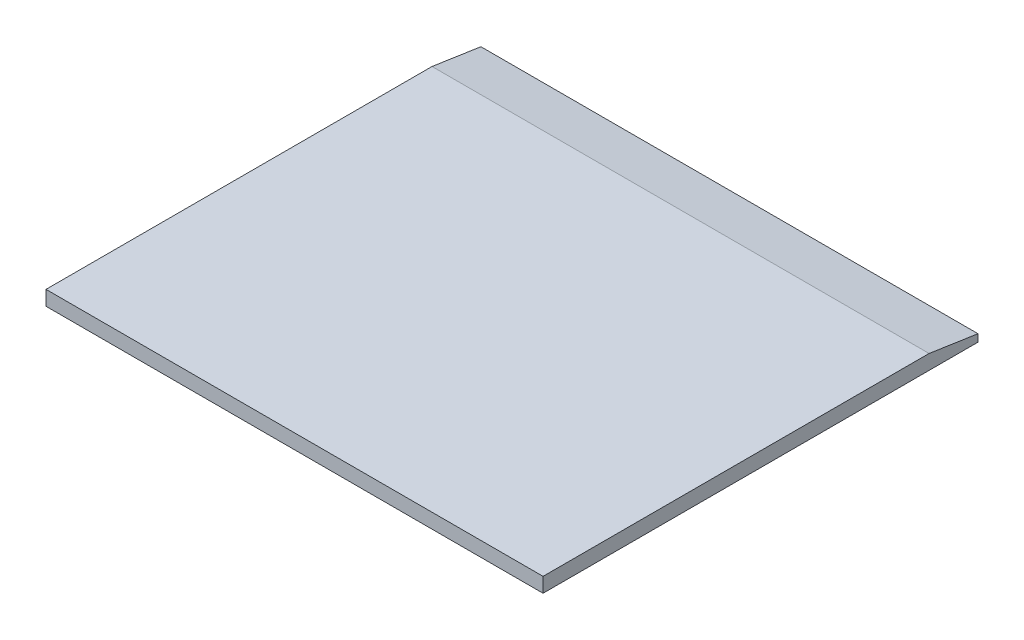
ISO-10303-21;
HEADER;
FILE_DESCRIPTION(('STEP AP214'),'2;1');
FILE_NAME('part.step','',(''),(''),'','','');
FILE_SCHEMA(('AUTOMOTIVE_DESIGN { 1 0 10303 214 1 1 1 1 }'));
ENDSEC;
DATA;
#1=APPLICATION_CONTEXT('core data for automotive mechanical design processes');
#2=APPLICATION_PROTOCOL_DEFINITION('international standard','automotive_design',2000,#1);
#3=PRODUCT_CONTEXT('',#1,'mechanical');
#4=PRODUCT('Part','Part','',(#3));
#5=PRODUCT_RELATED_PRODUCT_CATEGORY('part','',(#4));
#6=PRODUCT_DEFINITION_FORMATION('','',#4);
#7=PRODUCT_DEFINITION_CONTEXT('part definition',#1,'design');
#8=PRODUCT_DEFINITION('design','',#6,#7);
#9=PRODUCT_DEFINITION_SHAPE('','',#8);
#10=(LENGTH_UNIT() NAMED_UNIT(*) SI_UNIT(.MILLI.,.METRE.));
#11=(NAMED_UNIT(*) PLANE_ANGLE_UNIT() SI_UNIT($,.RADIAN.));
#12=(NAMED_UNIT(*) SI_UNIT($,.STERADIAN.) SOLID_ANGLE_UNIT());
#13=UNCERTAINTY_MEASURE_WITH_UNIT(LENGTH_MEASURE(1.E-05),#10,'distance_accuracy_value','');
#14=(GEOMETRIC_REPRESENTATION_CONTEXT(3) GLOBAL_UNCERTAINTY_ASSIGNED_CONTEXT((#13)) GLOBAL_UNIT_ASSIGNED_CONTEXT((#10,
#11,#12)) REPRESENTATION_CONTEXT('',''));
#15=CARTESIAN_POINT('',(0.,0.,0.));
#16=DIRECTION('',(0.,0.,1.));
#17=DIRECTION('',(1.,0.,0.));
#18=AXIS2_PLACEMENT_3D('',#15,#16,#17);
#19=CARTESIAN_POINT('',(0.,3.,0.));
#20=DIRECTION('',(1.,0.,0.));
#21=DIRECTION('',(0.,0.,-1.));
#22=AXIS2_PLACEMENT_3D('',#19,#20,#21);
#23=PLANE('',#22);
#24=DIRECTION('',(0.,0.,1.));
#25=VECTOR('',#24,1.);
#26=CARTESIAN_POINT('',(0.,3.,0.));
#27=LINE('',#26,#25);
#28=CARTESIAN_POINT('',(0.,3.,-78.9));
#29=VERTEX_POINT('',#28);
#30=CARTESIAN_POINT('',(0.,3.,0.));
#31=VERTEX_POINT('',#30);
#32=EDGE_CURVE('E100',#29,#31,#27,.T.);
#33=ORIENTED_EDGE('',*,*,#32,.F.);
#34=DIRECTION('',(0.,-0.148340452930245,-0.988936352868298));
#35=VECTOR('',#34,1.);
#36=CARTESIAN_POINT('',(0.,1.5,-88.9));
#37=LINE('',#36,#35);
#38=CARTESIAN_POINT('',(0.,1.5,-88.9));
#39=VERTEX_POINT('',#38);
#40=EDGE_CURVE('E53',#29,#39,#37,.T.);
#41=ORIENTED_EDGE('',*,*,#40,.T.);
#42=DIRECTION('',(0.,-1.,0.));
#43=VECTOR('',#42,1.);
#44=CARTESIAN_POINT('',(0.,3.,-88.9));
#45=LINE('',#44,#43);
#46=CARTESIAN_POINT('',(0.,0.,-88.9));
#47=VERTEX_POINT('',#46);
#48=EDGE_CURVE('E81',#39,#47,#45,.T.);
#49=ORIENTED_EDGE('',*,*,#48,.T.);
#50=DIRECTION('',(0.,0.,1.));
#51=VECTOR('',#50,1.);
#52=CARTESIAN_POINT('',(0.,0.,0.));
#53=LINE('',#52,#51);
#54=CARTESIAN_POINT('',(0.,0.,0.));
#55=VERTEX_POINT('',#54);
#56=EDGE_CURVE('E86',#47,#55,#53,.T.);
#57=ORIENTED_EDGE('',*,*,#56,.T.);
#58=DIRECTION('',(0.,-1.,0.));
#59=VECTOR('',#58,1.);
#60=CARTESIAN_POINT('',(0.,3.,0.));
#61=LINE('',#60,#59);
#62=EDGE_CURVE('E11',#31,#55,#61,.T.);
#63=ORIENTED_EDGE('',*,*,#62,.F.);
#64=EDGE_LOOP('',(#33,#41,#49,#57,#63));
#65=FACE_BOUND('',#64,.T.);
#66=ADVANCED_FACE('F39',(#65),#23,.F.);
#67=CARTESIAN_POINT('',(0.,3.,0.));
#68=DIRECTION('',(0.,0.,-1.));
#69=DIRECTION('',(-1.,0.,0.));
#70=AXIS2_PLACEMENT_3D('',#67,#68,#69);
#71=PLANE('',#70);
#72=DIRECTION('',(1.,0.,0.));
#73=VECTOR('',#72,1.);
#74=CARTESIAN_POINT('',(0.,0.,0.));
#75=LINE('',#74,#73);
#76=CARTESIAN_POINT('',(101.6,0.,0.));
#77=VERTEX_POINT('',#76);
#78=EDGE_CURVE('E104',#55,#77,#75,.T.);
#79=ORIENTED_EDGE('',*,*,#78,.T.);
#80=DIRECTION('',(0.,-1.,0.));
#81=VECTOR('',#80,1.);
#82=CARTESIAN_POINT('',(101.6,3.,0.));
#83=LINE('',#82,#81);
#84=CARTESIAN_POINT('',(101.6,3.,0.));
#85=VERTEX_POINT('',#84);
#86=EDGE_CURVE('E46',#85,#77,#83,.T.);
#87=ORIENTED_EDGE('',*,*,#86,.F.);
#88=DIRECTION('',(1.,0.,0.));
#89=VECTOR('',#88,1.);
#90=CARTESIAN_POINT('',(0.,3.,0.));
#91=LINE('',#90,#89);
#92=EDGE_CURVE('E62',#31,#85,#91,.T.);
#93=ORIENTED_EDGE('',*,*,#92,.F.);
#94=ORIENTED_EDGE('',*,*,#62,.T.);
#95=EDGE_LOOP('',(#79,#87,#93,#94));
#96=FACE_BOUND('',#95,.T.);
#97=ADVANCED_FACE('F120',(#96),#71,.F.);
#98=CARTESIAN_POINT('',(101.6,3.,0.));
#99=DIRECTION('',(-1.,0.,0.));
#100=DIRECTION('',(0.,0.,1.));
#101=AXIS2_PLACEMENT_3D('',#98,#99,#100);
#102=PLANE('',#101);
#103=DIRECTION('',(0.,-1.,0.));
#104=VECTOR('',#103,1.);
#105=CARTESIAN_POINT('',(101.6,3.,-88.9));
#106=LINE('',#105,#104);
#107=CARTESIAN_POINT('',(101.6,1.5,-88.9));
#108=VERTEX_POINT('',#107);
#109=CARTESIAN_POINT('',(101.6,0.,-88.9));
#110=VERTEX_POINT('',#109);
#111=EDGE_CURVE('E90',#108,#110,#106,.T.);
#112=ORIENTED_EDGE('',*,*,#111,.F.);
#113=DIRECTION('',(0.,0.148340452930245,0.988936352868298));
#114=VECTOR('',#113,1.);
#115=CARTESIAN_POINT('',(101.6,14.5745721271394,-1.73618581907091));
#116=LINE('',#115,#114);
#117=CARTESIAN_POINT('',(101.6,3.,-78.9));
#118=VERTEX_POINT('',#117);
#119=EDGE_CURVE('E105',#108,#118,#116,.T.);
#120=ORIENTED_EDGE('',*,*,#119,.T.);
#121=DIRECTION('',(0.,0.,-1.));
#122=VECTOR('',#121,1.);
#123=CARTESIAN_POINT('',(101.6,3.,0.));
#124=LINE('',#123,#122);
#125=EDGE_CURVE('E91',#85,#118,#124,.T.);
#126=ORIENTED_EDGE('',*,*,#125,.F.);
#127=ORIENTED_EDGE('',*,*,#86,.T.);
#128=DIRECTION('',(0.,0.,-1.));
#129=VECTOR('',#128,1.);
#130=CARTESIAN_POINT('',(101.6,0.,0.));
#131=LINE('',#130,#129);
#132=EDGE_CURVE('E101',#77,#110,#131,.T.);
#133=ORIENTED_EDGE('',*,*,#132,.T.);
#134=EDGE_LOOP('',(#112,#120,#126,#127,#133));
#135=FACE_BOUND('',#134,.T.);
#136=ADVANCED_FACE('F118',(#135),#102,.F.);
#137=CARTESIAN_POINT('',(0.,3.,-88.9));
#138=DIRECTION('',(0.,0.,1.));
#139=DIRECTION('',(1.,0.,0.));
#140=AXIS2_PLACEMENT_3D('',#137,#138,#139);
#141=PLANE('',#140);
#142=ORIENTED_EDGE('',*,*,#48,.F.);
#143=DIRECTION('',(1.,0.,0.));
#144=VECTOR('',#143,1.);
#145=CARTESIAN_POINT('',(0.,1.5,-88.9));
#146=LINE('',#145,#144);
#147=EDGE_CURVE('E109',#39,#108,#146,.T.);
#148=ORIENTED_EDGE('',*,*,#147,.T.);
#149=ORIENTED_EDGE('',*,*,#111,.T.);
#150=DIRECTION('',(-1.,0.,0.));
#151=VECTOR('',#150,1.);
#152=CARTESIAN_POINT('',(0.,0.,-88.9));
#153=LINE('',#152,#151);
#154=EDGE_CURVE('E94',#110,#47,#153,.T.);
#155=ORIENTED_EDGE('',*,*,#154,.T.);
#156=EDGE_LOOP('',(#142,#148,#149,#155));
#157=FACE_BOUND('',#156,.T.);
#158=ADVANCED_FACE('F95',(#157),#141,.F.);
#159=CARTESIAN_POINT('',(0.,3.,0.));
#160=DIRECTION('',(0.,-1.,0.));
#161=DIRECTION('',(0.,0.,-1.));
#162=AXIS2_PLACEMENT_3D('',#159,#160,#161);
#163=PLANE('',#162);
#164=ORIENTED_EDGE('',*,*,#125,.T.);
#165=DIRECTION('',(1.,0.,0.));
#166=VECTOR('',#165,1.);
#167=CARTESIAN_POINT('',(0.,3.,-78.9));
#168=LINE('',#167,#166);
#169=EDGE_CURVE('E123',#29,#118,#168,.T.);
#170=ORIENTED_EDGE('',*,*,#169,.F.);
#171=ORIENTED_EDGE('',*,*,#32,.T.);
#172=ORIENTED_EDGE('',*,*,#92,.T.);
#173=EDGE_LOOP('',(#164,#170,#171,#172));
#174=FACE_BOUND('',#173,.T.);
#175=ADVANCED_FACE('F129',(#174),#163,.F.);
#176=CARTESIAN_POINT('',(0.,0.,0.));
#177=DIRECTION('',(0.,-1.,0.));
#178=DIRECTION('',(0.,0.,-1.));
#179=AXIS2_PLACEMENT_3D('',#176,#177,#178);
#180=PLANE('',#179);
#181=ORIENTED_EDGE('',*,*,#56,.F.);
#182=ORIENTED_EDGE('',*,*,#154,.F.);
#183=ORIENTED_EDGE('',*,*,#132,.F.);
#184=ORIENTED_EDGE('',*,*,#78,.F.);
#185=EDGE_LOOP('',(#181,#182,#183,#184));
#186=FACE_BOUND('',#185,.T.);
#187=ADVANCED_FACE('F103',(#186),#180,.T.);
#188=CARTESIAN_POINT('',(0.,1.5,-88.9));
#189=DIRECTION('',(0.,-0.988936352868298,0.148340452930245));
#190=DIRECTION('',(0.,-0.148340452930245,-0.988936352868298));
#191=AXIS2_PLACEMENT_3D('',#188,#189,#190);
#192=PLANE('',#191);
#193=ORIENTED_EDGE('',*,*,#147,.F.);
#194=ORIENTED_EDGE('',*,*,#40,.F.);
#195=ORIENTED_EDGE('',*,*,#169,.T.);
#196=ORIENTED_EDGE('',*,*,#119,.F.);
#197=EDGE_LOOP('',(#193,#194,#195,#196));
#198=FACE_BOUND('',#197,.T.);
#199=ADVANCED_FACE('F130',(#198),#192,.F.);
#200=CLOSED_SHELL('',(#66,#97,#136,#158,#175,#187,#199));
#201=MANIFOLD_SOLID_BREP('B2',#200);
#202=ADVANCED_BREP_SHAPE_REPRESENTATION('',(#18,#201),#14);
#203=SHAPE_DEFINITION_REPRESENTATION(#9,#202);
ENDSEC;
END-ISO-10303-21;
